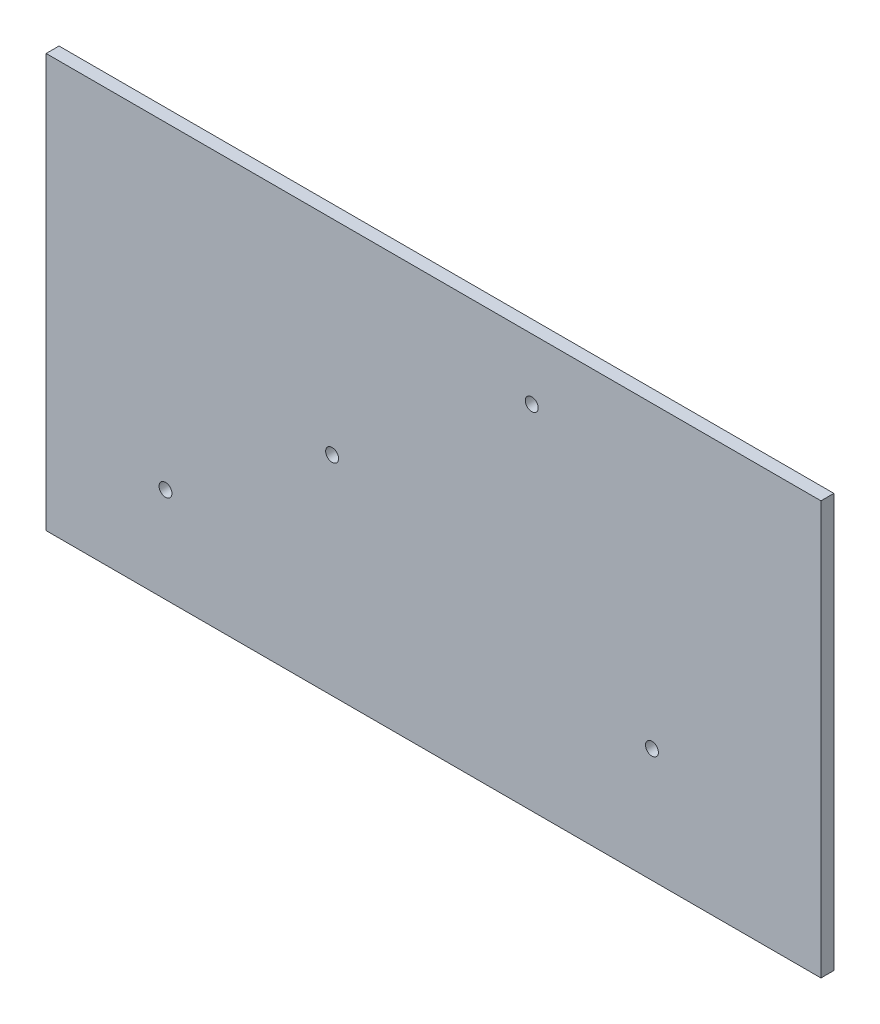
ISO-10303-21;
HEADER;
FILE_DESCRIPTION(('STEP AP214'),'2;1');
FILE_NAME('part.step','',(''),(''),'','','');
FILE_SCHEMA(('AUTOMOTIVE_DESIGN { 1 0 10303 214 1 1 1 1 }'));
ENDSEC;
DATA;
#1=APPLICATION_CONTEXT('core data for automotive mechanical design processes');
#2=APPLICATION_PROTOCOL_DEFINITION('international standard','automotive_design',2000,#1);
#3=PRODUCT_CONTEXT('',#1,'mechanical');
#4=PRODUCT('Part','Part','',(#3));
#5=PRODUCT_RELATED_PRODUCT_CATEGORY('part','',(#4));
#6=PRODUCT_DEFINITION_FORMATION('','',#4);
#7=PRODUCT_DEFINITION_CONTEXT('part definition',#1,'design');
#8=PRODUCT_DEFINITION('design','',#6,#7);
#9=PRODUCT_DEFINITION_SHAPE('','',#8);
#10=(LENGTH_UNIT() NAMED_UNIT(*) SI_UNIT(.MILLI.,.METRE.));
#11=(NAMED_UNIT(*) PLANE_ANGLE_UNIT() SI_UNIT($,.RADIAN.));
#12=(NAMED_UNIT(*) SI_UNIT($,.STERADIAN.) SOLID_ANGLE_UNIT());
#13=UNCERTAINTY_MEASURE_WITH_UNIT(LENGTH_MEASURE(1.E-05),#10,'distance_accuracy_value','');
#14=(GEOMETRIC_REPRESENTATION_CONTEXT(3) GLOBAL_UNCERTAINTY_ASSIGNED_CONTEXT((#13)) GLOBAL_UNIT_ASSIGNED_CONTEXT((#10,
#11,#12)) REPRESENTATION_CONTEXT('',''));
#15=CARTESIAN_POINT('',(0.,0.,0.));
#16=DIRECTION('',(0.,0.,1.));
#17=DIRECTION('',(1.,0.,0.));
#18=AXIS2_PLACEMENT_3D('',#15,#16,#17);
#19=CARTESIAN_POINT('',(0.,0.,10.));
#20=DIRECTION('',(0.,0.,-1.));
#21=DIRECTION('',(-1.,0.,0.));
#22=AXIS2_PLACEMENT_3D('',#19,#20,#21);
#23=PLANE('',#22);
#24=DIRECTION('',(0.,-1.,0.));
#25=VECTOR('',#24,1.);
#26=CARTESIAN_POINT('',(0.,0.,10.));
#27=LINE('',#26,#25);
#28=CARTESIAN_POINT('',(0.,320.,10.));
#29=VERTEX_POINT('',#28);
#30=CARTESIAN_POINT('',(0.,0.,10.));
#31=VERTEX_POINT('',#30);
#32=EDGE_CURVE('E85',#29,#31,#27,.T.);
#33=ORIENTED_EDGE('',*,*,#32,.T.);
#34=DIRECTION('',(1.,0.,0.));
#35=VECTOR('',#34,1.);
#36=CARTESIAN_POINT('',(0.,0.,10.));
#37=LINE('',#36,#35);
#38=CARTESIAN_POINT('',(600.,0.,10.));
#39=VERTEX_POINT('',#38);
#40=EDGE_CURVE('E80',#31,#39,#37,.T.);
#41=ORIENTED_EDGE('',*,*,#40,.T.);
#42=DIRECTION('',(0.,1.,0.));
#43=VECTOR('',#42,1.);
#44=CARTESIAN_POINT('',(600.,0.,10.));
#45=LINE('',#44,#43);
#46=CARTESIAN_POINT('',(600.,320.,10.));
#47=VERTEX_POINT('',#46);
#48=EDGE_CURVE('E83',#39,#47,#45,.T.);
#49=ORIENTED_EDGE('',*,*,#48,.T.);
#50=DIRECTION('',(-1.,0.,0.));
#51=VECTOR('',#50,1.);
#52=CARTESIAN_POINT('',(0.,320.,10.));
#53=LINE('',#52,#51);
#54=EDGE_CURVE('E50',#47,#29,#53,.T.);
#55=ORIENTED_EDGE('',*,*,#54,.T.);
#56=EDGE_LOOP('',(#33,#41,#49,#55));
#57=FACE_BOUND('',#56,.T.);
#58=CARTESIAN_POINT('',(221.459837977554,161.50519060267,10.));
#59=DIRECTION('',(0.,0.,1.));
#60=DIRECTION('',(1.,0.,0.));
#61=AXIS2_PLACEMENT_3D('',#58,#59,#60);
#62=CIRCLE('',#61,5.00000000000002);
#63=CARTESIAN_POINT('',(226.459837977554,161.50519060267,10.));
#64=VERTEX_POINT('',#63);
#65=EDGE_CURVE('E100',#64,#64,#62,.T.);
#66=ORIENTED_EDGE('',*,*,#65,.F.);
#67=EDGE_LOOP('',(#66));
#68=FACE_BOUND('',#67,.T.);
#69=CARTESIAN_POINT('',(92.4364696655714,73.6134329941716,10.));
#70=DIRECTION('',(0.,0.,1.));
#71=DIRECTION('',(1.,0.,0.));
#72=AXIS2_PLACEMENT_3D('',#69,#70,#71);
#73=CIRCLE('',#72,5.00000000000002);
#74=CARTESIAN_POINT('',(97.4364696655714,73.6134329941716,10.));
#75=VERTEX_POINT('',#74);
#76=EDGE_CURVE('E115',#75,#75,#73,.T.);
#77=ORIENTED_EDGE('',*,*,#76,.F.);
#78=EDGE_LOOP('',(#77));
#79=FACE_BOUND('',#78,.T.);
#80=CARTESIAN_POINT('',(376.028101358016,272.777021663674,10.));
#81=DIRECTION('',(0.,0.,1.));
#82=DIRECTION('',(1.,0.,0.));
#83=AXIS2_PLACEMENT_3D('',#80,#81,#82);
#84=CIRCLE('',#83,4.99999999999999);
#85=CARTESIAN_POINT('',(381.028101358016,272.777021663674,10.));
#86=VERTEX_POINT('',#85);
#87=EDGE_CURVE('E121',#86,#86,#84,.T.);
#88=ORIENTED_EDGE('',*,*,#87,.F.);
#89=EDGE_LOOP('',(#88));
#90=FACE_BOUND('',#89,.T.);
#91=CARTESIAN_POINT('',(469.115430844848,88.334219982787,10.));
#92=DIRECTION('',(0.,0.,1.));
#93=DIRECTION('',(1.,0.,0.));
#94=AXIS2_PLACEMENT_3D('',#91,#92,#93);
#95=CIRCLE('',#94,4.99999999999999);
#96=CARTESIAN_POINT('',(474.115430844848,88.334219982787,10.));
#97=VERTEX_POINT('',#96);
#98=EDGE_CURVE('E127',#97,#97,#95,.T.);
#99=ORIENTED_EDGE('',*,*,#98,.F.);
#100=EDGE_LOOP('',(#99));
#101=FACE_BOUND('',#100,.T.);
#102=ADVANCED_FACE('F33',(#57,#68,#79,#90,#101),#23,.F.);
#103=CARTESIAN_POINT('',(0.,0.,0.));
#104=DIRECTION('',(0.,0.,-1.));
#105=DIRECTION('',(-1.,0.,0.));
#106=AXIS2_PLACEMENT_3D('',#103,#104,#105);
#107=PLANE('',#106);
#108=CARTESIAN_POINT('',(376.028101358016,272.777021663674,0.));
#109=DIRECTION('',(0.,0.,1.));
#110=DIRECTION('',(1.,0.,0.));
#111=AXIS2_PLACEMENT_3D('',#108,#109,#110);
#112=CIRCLE('',#111,4.99999999999999);
#113=CARTESIAN_POINT('',(381.028101358016,272.777021663674,0.));
#114=VERTEX_POINT('',#113);
#115=EDGE_CURVE('E124',#114,#114,#112,.T.);
#116=ORIENTED_EDGE('',*,*,#115,.T.);
#117=EDGE_LOOP('',(#116));
#118=FACE_BOUND('',#117,.T.);
#119=CARTESIAN_POINT('',(221.459837977554,161.50519060267,0.));
#120=DIRECTION('',(0.,0.,1.));
#121=DIRECTION('',(1.,0.,0.));
#122=AXIS2_PLACEMENT_3D('',#119,#120,#121);
#123=CIRCLE('',#122,5.00000000000002);
#124=CARTESIAN_POINT('',(226.459837977554,161.50519060267,0.));
#125=VERTEX_POINT('',#124);
#126=EDGE_CURVE('E112',#125,#125,#123,.T.);
#127=ORIENTED_EDGE('',*,*,#126,.T.);
#128=EDGE_LOOP('',(#127));
#129=FACE_BOUND('',#128,.T.);
#130=DIRECTION('',(0.,-1.,0.));
#131=VECTOR('',#130,1.);
#132=CARTESIAN_POINT('',(0.,0.,0.));
#133=LINE('',#132,#131);
#134=CARTESIAN_POINT('',(0.,320.,0.));
#135=VERTEX_POINT('',#134);
#136=CARTESIAN_POINT('',(0.,0.,0.));
#137=VERTEX_POINT('',#136);
#138=EDGE_CURVE('E97',#135,#137,#133,.T.);
#139=ORIENTED_EDGE('',*,*,#138,.F.);
#140=DIRECTION('',(-1.,0.,0.));
#141=VECTOR('',#140,1.);
#142=CARTESIAN_POINT('',(0.,320.,0.));
#143=LINE('',#142,#141);
#144=CARTESIAN_POINT('',(600.,320.,0.));
#145=VERTEX_POINT('',#144);
#146=EDGE_CURVE('E73',#145,#135,#143,.T.);
#147=ORIENTED_EDGE('',*,*,#146,.F.);
#148=DIRECTION('',(0.,1.,0.));
#149=VECTOR('',#148,1.);
#150=CARTESIAN_POINT('',(600.,0.,0.));
#151=LINE('',#150,#149);
#152=CARTESIAN_POINT('',(600.,0.,0.));
#153=VERTEX_POINT('',#152);
#154=EDGE_CURVE('E67',#153,#145,#151,.T.);
#155=ORIENTED_EDGE('',*,*,#154,.F.);
#156=DIRECTION('',(1.,0.,0.));
#157=VECTOR('',#156,1.);
#158=CARTESIAN_POINT('',(0.,0.,0.));
#159=LINE('',#158,#157);
#160=EDGE_CURVE('E89',#137,#153,#159,.T.);
#161=ORIENTED_EDGE('',*,*,#160,.F.);
#162=EDGE_LOOP('',(#139,#147,#155,#161));
#163=FACE_BOUND('',#162,.T.);
#164=CARTESIAN_POINT('',(92.4364696655714,73.6134329941716,0.));
#165=DIRECTION('',(0.,0.,1.));
#166=DIRECTION('',(1.,0.,0.));
#167=AXIS2_PLACEMENT_3D('',#164,#165,#166);
#168=CIRCLE('',#167,5.00000000000002);
#169=CARTESIAN_POINT('',(97.4364696655714,73.6134329941716,0.));
#170=VERTEX_POINT('',#169);
#171=EDGE_CURVE('E118',#170,#170,#168,.T.);
#172=ORIENTED_EDGE('',*,*,#171,.T.);
#173=EDGE_LOOP('',(#172));
#174=FACE_BOUND('',#173,.T.);
#175=CARTESIAN_POINT('',(469.115430844848,88.334219982787,0.));
#176=DIRECTION('',(0.,0.,1.));
#177=DIRECTION('',(1.,0.,0.));
#178=AXIS2_PLACEMENT_3D('',#175,#176,#177);
#179=CIRCLE('',#178,4.99999999999999);
#180=CARTESIAN_POINT('',(474.115430844848,88.334219982787,0.));
#181=VERTEX_POINT('',#180);
#182=EDGE_CURVE('E130',#181,#181,#179,.T.);
#183=ORIENTED_EDGE('',*,*,#182,.T.);
#184=EDGE_LOOP('',(#183));
#185=FACE_BOUND('',#184,.T.);
#186=ADVANCED_FACE('F108',(#118,#129,#163,#174,#185),#107,.T.);
#187=CARTESIAN_POINT('',(0.,0.,10.));
#188=DIRECTION('',(1.,0.,0.));
#189=DIRECTION('',(0.,0.,-1.));
#190=AXIS2_PLACEMENT_3D('',#187,#188,#189);
#191=PLANE('',#190);
#192=ORIENTED_EDGE('',*,*,#138,.T.);
#193=DIRECTION('',(0.,0.,-1.));
#194=VECTOR('',#193,1.);
#195=CARTESIAN_POINT('',(0.,0.,10.));
#196=LINE('',#195,#194);
#197=EDGE_CURVE('E11',#31,#137,#196,.T.);
#198=ORIENTED_EDGE('',*,*,#197,.F.);
#199=ORIENTED_EDGE('',*,*,#32,.F.);
#200=DIRECTION('',(0.,0.,-1.));
#201=VECTOR('',#200,1.);
#202=CARTESIAN_POINT('',(0.,320.,10.));
#203=LINE('',#202,#201);
#204=EDGE_CURVE('E93',#29,#135,#203,.T.);
#205=ORIENTED_EDGE('',*,*,#204,.T.);
#206=EDGE_LOOP('',(#192,#198,#199,#205));
#207=FACE_BOUND('',#206,.T.);
#208=ADVANCED_FACE('F35',(#207),#191,.F.);
#209=CARTESIAN_POINT('',(0.,0.,10.));
#210=DIRECTION('',(0.,1.,0.));
#211=DIRECTION('',(0.,0.,1.));
#212=AXIS2_PLACEMENT_3D('',#209,#210,#211);
#213=PLANE('',#212);
#214=ORIENTED_EDGE('',*,*,#160,.T.);
#215=DIRECTION('',(0.,0.,-1.));
#216=VECTOR('',#215,1.);
#217=CARTESIAN_POINT('',(600.,0.,10.));
#218=LINE('',#217,#216);
#219=EDGE_CURVE('E42',#39,#153,#218,.T.);
#220=ORIENTED_EDGE('',*,*,#219,.F.);
#221=ORIENTED_EDGE('',*,*,#40,.F.);
#222=ORIENTED_EDGE('',*,*,#197,.T.);
#223=EDGE_LOOP('',(#214,#220,#221,#222));
#224=FACE_BOUND('',#223,.T.);
#225=ADVANCED_FACE('F88',(#224),#213,.F.);
#226=CARTESIAN_POINT('',(600.,0.,10.));
#227=DIRECTION('',(-1.,0.,0.));
#228=DIRECTION('',(0.,0.,1.));
#229=AXIS2_PLACEMENT_3D('',#226,#227,#228);
#230=PLANE('',#229);
#231=ORIENTED_EDGE('',*,*,#154,.T.);
#232=DIRECTION('',(0.,0.,-1.));
#233=VECTOR('',#232,1.);
#234=CARTESIAN_POINT('',(600.,320.,10.));
#235=LINE('',#234,#233);
#236=EDGE_CURVE('E90',#47,#145,#235,.T.);
#237=ORIENTED_EDGE('',*,*,#236,.F.);
#238=ORIENTED_EDGE('',*,*,#48,.F.);
#239=ORIENTED_EDGE('',*,*,#219,.T.);
#240=EDGE_LOOP('',(#231,#237,#238,#239));
#241=FACE_BOUND('',#240,.T.);
#242=ADVANCED_FACE('F91',(#241),#230,.F.);
#243=CARTESIAN_POINT('',(0.,320.,10.));
#244=DIRECTION('',(0.,-1.,0.));
#245=DIRECTION('',(0.,0.,-1.));
#246=AXIS2_PLACEMENT_3D('',#243,#244,#245);
#247=PLANE('',#246);
#248=ORIENTED_EDGE('',*,*,#146,.T.);
#249=ORIENTED_EDGE('',*,*,#204,.F.);
#250=ORIENTED_EDGE('',*,*,#54,.F.);
#251=ORIENTED_EDGE('',*,*,#236,.T.);
#252=EDGE_LOOP('',(#248,#249,#250,#251));
#253=FACE_BOUND('',#252,.T.);
#254=ADVANCED_FACE('F105',(#253),#247,.F.);
#255=CARTESIAN_POINT('',(221.459837977554,161.50519060267,10.));
#256=DIRECTION('',(0.,0.,-1.));
#257=DIRECTION('',(-1.,0.,0.));
#258=AXIS2_PLACEMENT_3D('',#255,#256,#257);
#259=CYLINDRICAL_SURFACE('',#258,5.00000000000002);
#260=ORIENTED_EDGE('',*,*,#65,.T.);
#261=EDGE_LOOP('',(#260));
#262=FACE_BOUND('',#261,.T.);
#263=ORIENTED_EDGE('',*,*,#126,.F.);
#264=EDGE_LOOP('',(#263));
#265=FACE_BOUND('',#264,.T.);
#266=ADVANCED_FACE('F147',(#262,#265),#259,.F.);
#267=CARTESIAN_POINT('',(92.4364696655714,73.6134329941716,10.));
#268=DIRECTION('',(0.,0.,-1.));
#269=DIRECTION('',(-1.,0.,0.));
#270=AXIS2_PLACEMENT_3D('',#267,#268,#269);
#271=CYLINDRICAL_SURFACE('',#270,5.00000000000002);
#272=ORIENTED_EDGE('',*,*,#76,.T.);
#273=EDGE_LOOP('',(#272));
#274=FACE_BOUND('',#273,.T.);
#275=ORIENTED_EDGE('',*,*,#171,.F.);
#276=EDGE_LOOP('',(#275));
#277=FACE_BOUND('',#276,.T.);
#278=ADVANCED_FACE('F193',(#274,#277),#271,.F.);
#279=CARTESIAN_POINT('',(376.028101358016,272.777021663674,10.));
#280=DIRECTION('',(0.,0.,-1.));
#281=DIRECTION('',(-1.,0.,0.));
#282=AXIS2_PLACEMENT_3D('',#279,#280,#281);
#283=CYLINDRICAL_SURFACE('',#282,4.99999999999999);
#284=ORIENTED_EDGE('',*,*,#87,.T.);
#285=EDGE_LOOP('',(#284));
#286=FACE_BOUND('',#285,.T.);
#287=ORIENTED_EDGE('',*,*,#115,.F.);
#288=EDGE_LOOP('',(#287));
#289=FACE_BOUND('',#288,.T.);
#290=ADVANCED_FACE('F201',(#286,#289),#283,.F.);
#291=CARTESIAN_POINT('',(469.115430844848,88.334219982787,10.));
#292=DIRECTION('',(0.,0.,-1.));
#293=DIRECTION('',(-1.,0.,0.));
#294=AXIS2_PLACEMENT_3D('',#291,#292,#293);
#295=CYLINDRICAL_SURFACE('',#294,4.99999999999999);
#296=ORIENTED_EDGE('',*,*,#98,.T.);
#297=EDGE_LOOP('',(#296));
#298=FACE_BOUND('',#297,.T.);
#299=ORIENTED_EDGE('',*,*,#182,.F.);
#300=EDGE_LOOP('',(#299));
#301=FACE_BOUND('',#300,.T.);
#302=ADVANCED_FACE('F136',(#298,#301),#295,.F.);
#303=CLOSED_SHELL('',(#102,#186,#208,#225,#242,#254,#266,#278,#290,#302));
#304=MANIFOLD_SOLID_BREP('B2',#303);
#305=ADVANCED_BREP_SHAPE_REPRESENTATION('',(#18,#304),#14);
#306=SHAPE_DEFINITION_REPRESENTATION(#9,#305);
ENDSEC;
END-ISO-10303-21;
